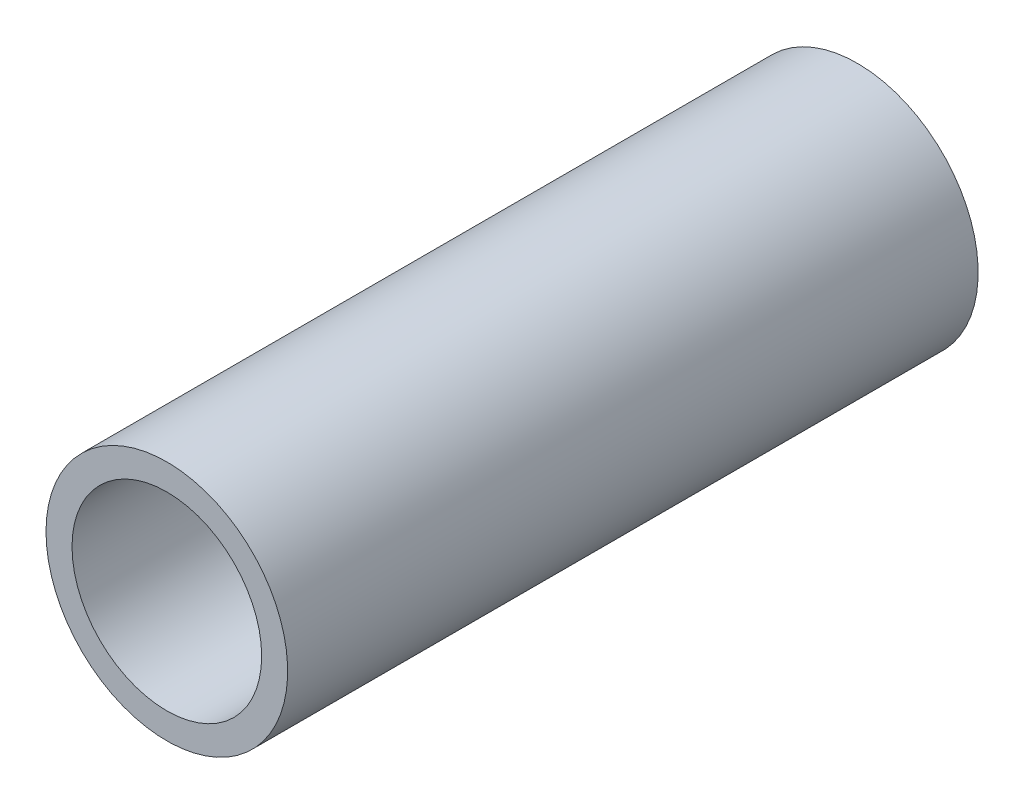
ISO-10303-21;
HEADER;
FILE_DESCRIPTION(('STEP AP214'),'2;1');
FILE_NAME('part.step','',(''),(''),'','','');
FILE_SCHEMA(('AUTOMOTIVE_DESIGN { 1 0 10303 214 1 1 1 1 }'));
ENDSEC;
DATA;
#1=APPLICATION_CONTEXT('core data for automotive mechanical design processes');
#2=APPLICATION_PROTOCOL_DEFINITION('international standard','automotive_design',2000,#1);
#3=PRODUCT_CONTEXT('',#1,'mechanical');
#4=PRODUCT('Part','Part','',(#3));
#5=PRODUCT_RELATED_PRODUCT_CATEGORY('part','',(#4));
#6=PRODUCT_DEFINITION_FORMATION('','',#4);
#7=PRODUCT_DEFINITION_CONTEXT('part definition',#1,'design');
#8=PRODUCT_DEFINITION('design','',#6,#7);
#9=PRODUCT_DEFINITION_SHAPE('','',#8);
#10=(LENGTH_UNIT() NAMED_UNIT(*) SI_UNIT(.MILLI.,.METRE.));
#11=(NAMED_UNIT(*) PLANE_ANGLE_UNIT() SI_UNIT($,.RADIAN.));
#12=(NAMED_UNIT(*) SI_UNIT($,.STERADIAN.) SOLID_ANGLE_UNIT());
#13=UNCERTAINTY_MEASURE_WITH_UNIT(LENGTH_MEASURE(1.E-05),#10,'distance_accuracy_value','');
#14=(GEOMETRIC_REPRESENTATION_CONTEXT(3) GLOBAL_UNCERTAINTY_ASSIGNED_CONTEXT((#13)) GLOBAL_UNIT_ASSIGNED_CONTEXT((#10,
#11,#12)) REPRESENTATION_CONTEXT('',''));
#15=CARTESIAN_POINT('',(0.,0.,0.));
#16=DIRECTION('',(0.,0.,1.));
#17=DIRECTION('',(1.,0.,0.));
#18=AXIS2_PLACEMENT_3D('',#15,#16,#17);
#19=CARTESIAN_POINT('',(0.,0.,76.2));
#20=DIRECTION('',(0.,0.,1.));
#21=DIRECTION('',(1.,0.,0.));
#22=AXIS2_PLACEMENT_3D('',#19,#20,#21);
#23=PLANE('',#22);
#24=CARTESIAN_POINT('',(0.,0.,76.2));
#25=DIRECTION('',(0.,0.,1.));
#26=DIRECTION('',(1.,0.,0.));
#27=AXIS2_PLACEMENT_3D('',#24,#25,#26);
#28=CIRCLE('',#27,13.335);
#29=CARTESIAN_POINT('',(-13.335,0.,76.2));
#30=VERTEX_POINT('',#29);
#31=EDGE_CURVE('E10',#30,#30,#28,.T.);
#32=ORIENTED_EDGE('',*,*,#31,.T.);
#33=EDGE_LOOP('',(#32));
#34=FACE_BOUND('',#33,.T.);
#35=CARTESIAN_POINT('',(0.,0.,76.2));
#36=DIRECTION('',(0.,0.,1.));
#37=DIRECTION('',(1.,0.,0.));
#38=AXIS2_PLACEMENT_3D('',#35,#36,#37);
#39=CIRCLE('',#38,10.4648);
#40=CARTESIAN_POINT('',(-10.4648,0.,76.2));
#41=VERTEX_POINT('',#40);
#42=EDGE_CURVE('E46',#41,#41,#39,.T.);
#43=ORIENTED_EDGE('',*,*,#42,.F.);
#44=EDGE_LOOP('',(#43));
#45=FACE_BOUND('',#44,.T.);
#46=ADVANCED_FACE('F35',(#34,#45),#23,.T.);
#47=CARTESIAN_POINT('',(0.,0.,0.));
#48=DIRECTION('',(0.,0.,1.));
#49=DIRECTION('',(1.,0.,0.));
#50=AXIS2_PLACEMENT_3D('',#47,#48,#49);
#51=PLANE('',#50);
#52=CARTESIAN_POINT('',(0.,0.,0.));
#53=DIRECTION('',(0.,0.,1.));
#54=DIRECTION('',(1.,0.,0.));
#55=AXIS2_PLACEMENT_3D('',#52,#53,#54);
#56=CIRCLE('',#55,13.335);
#57=CARTESIAN_POINT('',(-13.335,0.,0.));
#58=VERTEX_POINT('',#57);
#59=EDGE_CURVE('E39',#58,#58,#56,.T.);
#60=ORIENTED_EDGE('',*,*,#59,.F.);
#61=EDGE_LOOP('',(#60));
#62=FACE_BOUND('',#61,.T.);
#63=CARTESIAN_POINT('',(0.,0.,0.));
#64=DIRECTION('',(0.,0.,1.));
#65=DIRECTION('',(1.,0.,0.));
#66=AXIS2_PLACEMENT_3D('',#63,#64,#65);
#67=CIRCLE('',#66,10.4648);
#68=CARTESIAN_POINT('',(-10.4648,0.,0.));
#69=VERTEX_POINT('',#68);
#70=EDGE_CURVE('E48',#69,#69,#67,.T.);
#71=ORIENTED_EDGE('',*,*,#70,.T.);
#72=EDGE_LOOP('',(#71));
#73=FACE_BOUND('',#72,.T.);
#74=ADVANCED_FACE('F58',(#62,#73),#51,.F.);
#75=CARTESIAN_POINT('',(0.,0.,76.2));
#76=DIRECTION('',(0.,0.,-1.));
#77=DIRECTION('',(-1.,0.,0.));
#78=AXIS2_PLACEMENT_3D('',#75,#76,#77);
#79=CYLINDRICAL_SURFACE('',#78,13.335);
#80=CARTESIAN_POINT('',(-13.335,0.,76.2));
#81=CARTESIAN_POINT('',(-13.335,0.,75.40625));
#82=CARTESIAN_POINT('',(-13.335,0.,74.6125));
#83=CARTESIAN_POINT('',(-13.335,0.,73.025));
#84=CARTESIAN_POINT('',(-13.335,0.,72.23125));
#85=CARTESIAN_POINT('',(-13.335,0.,70.64375));
#86=CARTESIAN_POINT('',(-13.335,0.,69.85));
#87=CARTESIAN_POINT('',(-13.335,0.,68.2625));
#88=CARTESIAN_POINT('',(-13.335,0.,67.46875));
#89=CARTESIAN_POINT('',(-13.335,0.,65.88125));
#90=CARTESIAN_POINT('',(-13.335,0.,65.0875));
#91=CARTESIAN_POINT('',(-13.335,0.,63.5));
#92=CARTESIAN_POINT('',(-13.335,0.,62.70625));
#93=CARTESIAN_POINT('',(-13.335,0.,61.11875));
#94=CARTESIAN_POINT('',(-13.335,0.,60.325));
#95=CARTESIAN_POINT('',(-13.335,0.,58.7375));
#96=CARTESIAN_POINT('',(-13.335,0.,57.94375));
#97=CARTESIAN_POINT('',(-13.335,0.,56.35625));
#98=CARTESIAN_POINT('',(-13.335,0.,55.5625));
#99=CARTESIAN_POINT('',(-13.335,0.,53.975));
#100=CARTESIAN_POINT('',(-13.335,0.,53.18125));
#101=CARTESIAN_POINT('',(-13.335,0.,51.59375));
#102=CARTESIAN_POINT('',(-13.335,0.,50.8));
#103=CARTESIAN_POINT('',(-13.335,0.,49.2125));
#104=CARTESIAN_POINT('',(-13.335,0.,48.41875));
#105=CARTESIAN_POINT('',(-13.335,0.,46.83125));
#106=CARTESIAN_POINT('',(-13.335,0.,46.0375));
#107=CARTESIAN_POINT('',(-13.335,0.,44.45));
#108=CARTESIAN_POINT('',(-13.335,0.,43.65625));
#109=CARTESIAN_POINT('',(-13.335,0.,42.06875));
#110=CARTESIAN_POINT('',(-13.335,0.,41.275));
#111=CARTESIAN_POINT('',(-13.335,0.,39.6875));
#112=CARTESIAN_POINT('',(-13.335,0.,38.89375));
#113=CARTESIAN_POINT('',(-13.335,0.,37.30625));
#114=CARTESIAN_POINT('',(-13.335,0.,36.5125));
#115=CARTESIAN_POINT('',(-13.335,0.,34.925));
#116=CARTESIAN_POINT('',(-13.335,0.,34.13125));
#117=CARTESIAN_POINT('',(-13.335,0.,32.54375));
#118=CARTESIAN_POINT('',(-13.335,0.,31.75));
#119=CARTESIAN_POINT('',(-13.335,0.,30.1625));
#120=CARTESIAN_POINT('',(-13.335,0.,29.36875));
#121=CARTESIAN_POINT('',(-13.335,0.,27.78125));
#122=CARTESIAN_POINT('',(-13.335,0.,26.9875));
#123=CARTESIAN_POINT('',(-13.335,0.,25.4));
#124=CARTESIAN_POINT('',(-13.335,0.,24.60625));
#125=CARTESIAN_POINT('',(-13.335,0.,23.01875));
#126=CARTESIAN_POINT('',(-13.335,0.,22.225));
#127=CARTESIAN_POINT('',(-13.335,0.,20.6375));
#128=CARTESIAN_POINT('',(-13.335,0.,19.84375));
#129=CARTESIAN_POINT('',(-13.335,0.,18.25625));
#130=CARTESIAN_POINT('',(-13.335,0.,17.4625));
#131=CARTESIAN_POINT('',(-13.335,0.,15.875));
#132=CARTESIAN_POINT('',(-13.335,0.,15.08125));
#133=CARTESIAN_POINT('',(-13.335,0.,13.49375));
#134=CARTESIAN_POINT('',(-13.335,0.,12.7));
#135=CARTESIAN_POINT('',(-13.335,0.,11.1125));
#136=CARTESIAN_POINT('',(-13.335,0.,10.31875));
#137=CARTESIAN_POINT('',(-13.335,0.,8.73125));
#138=CARTESIAN_POINT('',(-13.335,0.,7.93750000000001));
#139=CARTESIAN_POINT('',(-13.335,0.,6.35));
#140=CARTESIAN_POINT('',(-13.335,0.,5.55625));
#141=CARTESIAN_POINT('',(-13.335,0.,3.96875));
#142=CARTESIAN_POINT('',(-13.335,0.,3.175));
#143=CARTESIAN_POINT('',(-13.335,0.,1.5875));
#144=CARTESIAN_POINT('',(-13.335,0.,0.793750000000001));
#145=CARTESIAN_POINT('',(-13.335,0.,0.));
#146=B_SPLINE_CURVE_WITH_KNOTS('',3,(#80,#81,#82,#83,#84,#85,#86,#87,#88,#89,#90,#91,#92,#93,
#94,#95,#96,#97,#98,#99,#100,#101,#102,#103,#104,#105,#106,#107,#108,#109,#110,#111,#112,#113,
#114,#115,#116,#117,#118,#119,#120,#121,#122,#123,#124,#125,#126,#127,#128,#129,#130,#131,#132,
#133,#134,#135,#136,#137,#138,#139,#140,#141,#142,#143,#144,#145),.UNSPECIFIED.,.F.,.F.,(4,2,2,
2,2,2,2,2,2,2,2,2,2,2,2,2,2,2,2,2,2,2,2,2,2,2,2,2,2,2,2,2,4),(0.,2.38124999999999,
4.76249999999999,7.14374999999999,9.52499999999999,11.90625,14.2875,16.66875,19.05,21.43125,
23.8125,26.19375,28.575,30.95625,33.3375,35.71875,38.1,40.48125,42.8625,45.24375,47.625,
50.00625,52.3875,54.76875,57.15,59.53125,61.9125,64.29375,66.675,69.05625,71.4375,73.81875,
76.2),.UNSPECIFIED.);
#147=EDGE_CURVE('BSEAM37',#30,#58,#146,.T.);
#148=ORIENTED_EDGE('',*,*,#31,.F.);
#149=ORIENTED_EDGE('',*,*,#59,.T.);
#150=ORIENTED_EDGE('',*,*,#147,.T.);
#151=ORIENTED_EDGE('',*,*,#147,.F.);
#152=EDGE_LOOP('',(#148,#150,#149,#151));
#153=FACE_BOUND('',#152,.T.);
#154=ADVANCED_FACE('F37',(#153),#79,.T.);
#155=CARTESIAN_POINT('',(0.,0.,76.2));
#156=DIRECTION('',(0.,0.,-1.));
#157=DIRECTION('',(-1.,0.,0.));
#158=AXIS2_PLACEMENT_3D('',#155,#156,#157);
#159=CYLINDRICAL_SURFACE('',#158,10.4648);
#160=CARTESIAN_POINT('',(-10.4648,0.,76.2));
#161=CARTESIAN_POINT('',(-10.4648,0.,75.40625));
#162=CARTESIAN_POINT('',(-10.4648,0.,74.6125));
#163=CARTESIAN_POINT('',(-10.4648,0.,73.025));
#164=CARTESIAN_POINT('',(-10.4648,0.,72.23125));
#165=CARTESIAN_POINT('',(-10.4648,0.,70.64375));
#166=CARTESIAN_POINT('',(-10.4648,0.,69.85));
#167=CARTESIAN_POINT('',(-10.4648,0.,68.2625));
#168=CARTESIAN_POINT('',(-10.4648,0.,67.46875));
#169=CARTESIAN_POINT('',(-10.4648,0.,65.88125));
#170=CARTESIAN_POINT('',(-10.4648,0.,65.0875));
#171=CARTESIAN_POINT('',(-10.4648,0.,63.5));
#172=CARTESIAN_POINT('',(-10.4648,0.,62.70625));
#173=CARTESIAN_POINT('',(-10.4648,0.,61.11875));
#174=CARTESIAN_POINT('',(-10.4648,0.,60.325));
#175=CARTESIAN_POINT('',(-10.4648,0.,58.7375));
#176=CARTESIAN_POINT('',(-10.4648,0.,57.94375));
#177=CARTESIAN_POINT('',(-10.4648,0.,56.35625));
#178=CARTESIAN_POINT('',(-10.4648,0.,55.5625));
#179=CARTESIAN_POINT('',(-10.4648,0.,53.975));
#180=CARTESIAN_POINT('',(-10.4648,0.,53.18125));
#181=CARTESIAN_POINT('',(-10.4648,0.,51.59375));
#182=CARTESIAN_POINT('',(-10.4648,0.,50.8));
#183=CARTESIAN_POINT('',(-10.4648,0.,49.2125));
#184=CARTESIAN_POINT('',(-10.4648,0.,48.41875));
#185=CARTESIAN_POINT('',(-10.4648,0.,46.83125));
#186=CARTESIAN_POINT('',(-10.4648,0.,46.0375));
#187=CARTESIAN_POINT('',(-10.4648,0.,44.45));
#188=CARTESIAN_POINT('',(-10.4648,0.,43.65625));
#189=CARTESIAN_POINT('',(-10.4648,0.,42.06875));
#190=CARTESIAN_POINT('',(-10.4648,0.,41.275));
#191=CARTESIAN_POINT('',(-10.4648,0.,39.6875));
#192=CARTESIAN_POINT('',(-10.4648,0.,38.89375));
#193=CARTESIAN_POINT('',(-10.4648,0.,37.30625));
#194=CARTESIAN_POINT('',(-10.4648,0.,36.5125));
#195=CARTESIAN_POINT('',(-10.4648,0.,34.925));
#196=CARTESIAN_POINT('',(-10.4648,0.,34.13125));
#197=CARTESIAN_POINT('',(-10.4648,0.,32.54375));
#198=CARTESIAN_POINT('',(-10.4648,0.,31.75));
#199=CARTESIAN_POINT('',(-10.4648,0.,30.1625));
#200=CARTESIAN_POINT('',(-10.4648,0.,29.36875));
#201=CARTESIAN_POINT('',(-10.4648,0.,27.78125));
#202=CARTESIAN_POINT('',(-10.4648,0.,26.9875));
#203=CARTESIAN_POINT('',(-10.4648,0.,25.4));
#204=CARTESIAN_POINT('',(-10.4648,0.,24.60625));
#205=CARTESIAN_POINT('',(-10.4648,0.,23.01875));
#206=CARTESIAN_POINT('',(-10.4648,0.,22.225));
#207=CARTESIAN_POINT('',(-10.4648,0.,20.6375));
#208=CARTESIAN_POINT('',(-10.4648,0.,19.84375));
#209=CARTESIAN_POINT('',(-10.4648,0.,18.25625));
#210=CARTESIAN_POINT('',(-10.4648,0.,17.4625));
#211=CARTESIAN_POINT('',(-10.4648,0.,15.875));
#212=CARTESIAN_POINT('',(-10.4648,0.,15.08125));
#213=CARTESIAN_POINT('',(-10.4648,0.,13.49375));
#214=CARTESIAN_POINT('',(-10.4648,0.,12.7));
#215=CARTESIAN_POINT('',(-10.4648,0.,11.1125));
#216=CARTESIAN_POINT('',(-10.4648,0.,10.31875));
#217=CARTESIAN_POINT('',(-10.4648,0.,8.73125));
#218=CARTESIAN_POINT('',(-10.4648,0.,7.93750000000001));
#219=CARTESIAN_POINT('',(-10.4648,0.,6.35));
#220=CARTESIAN_POINT('',(-10.4648,0.,5.55625));
#221=CARTESIAN_POINT('',(-10.4648,0.,3.96875));
#222=CARTESIAN_POINT('',(-10.4648,0.,3.175));
#223=CARTESIAN_POINT('',(-10.4648,0.,1.5875));
#224=CARTESIAN_POINT('',(-10.4648,0.,0.793750000000001));
#225=CARTESIAN_POINT('',(-10.4648,0.,0.));
#226=B_SPLINE_CURVE_WITH_KNOTS('',3,(#160,#161,#162,#163,#164,#165,#166,#167,#168,#169,#170,
#171,#172,#173,#174,#175,#176,#177,#178,#179,#180,#181,#182,#183,#184,#185,#186,#187,#188,#189,
#190,#191,#192,#193,#194,#195,#196,#197,#198,#199,#200,#201,#202,#203,#204,#205,#206,#207,#208,
#209,#210,#211,#212,#213,#214,#215,#216,#217,#218,#219,#220,#221,#222,#223,#224,#225),
.UNSPECIFIED.,.F.,.F.,(4,2,2,2,2,2,2,2,2,2,2,2,2,2,2,2,2,2,2,2,2,2,2,2,2,2,2,2,2,2,2,2,4),(0.,
2.38124999999999,4.76249999999999,7.14374999999999,9.52499999999999,11.90625,14.2875,16.66875,
19.05,21.43125,23.8125,26.19375,28.575,30.95625,33.3375,35.71875,38.1,40.48125,42.8625,45.24375,
47.625,50.00625,52.3875,54.76875,57.15,59.53125,61.9125,64.29375,66.675,69.05625,71.4375,
73.81875,76.2),.UNSPECIFIED.);
#227=EDGE_CURVE('BSEAM54',#41,#69,#226,.T.);
#228=ORIENTED_EDGE('',*,*,#42,.T.);
#229=ORIENTED_EDGE('',*,*,#70,.F.);
#230=ORIENTED_EDGE('',*,*,#227,.T.);
#231=ORIENTED_EDGE('',*,*,#227,.F.);
#232=EDGE_LOOP('',(#228,#230,#229,#231));
#233=FACE_BOUND('',#232,.T.);
#234=ADVANCED_FACE('F54',(#233),#159,.F.);
#235=CLOSED_SHELL('',(#46,#74,#154,#234));
#236=MANIFOLD_SOLID_BREP('B2',#235);
#237=ADVANCED_BREP_SHAPE_REPRESENTATION('',(#18,#236),#14);
#238=SHAPE_DEFINITION_REPRESENTATION(#9,#237);
ENDSEC;
END-ISO-10303-21;
